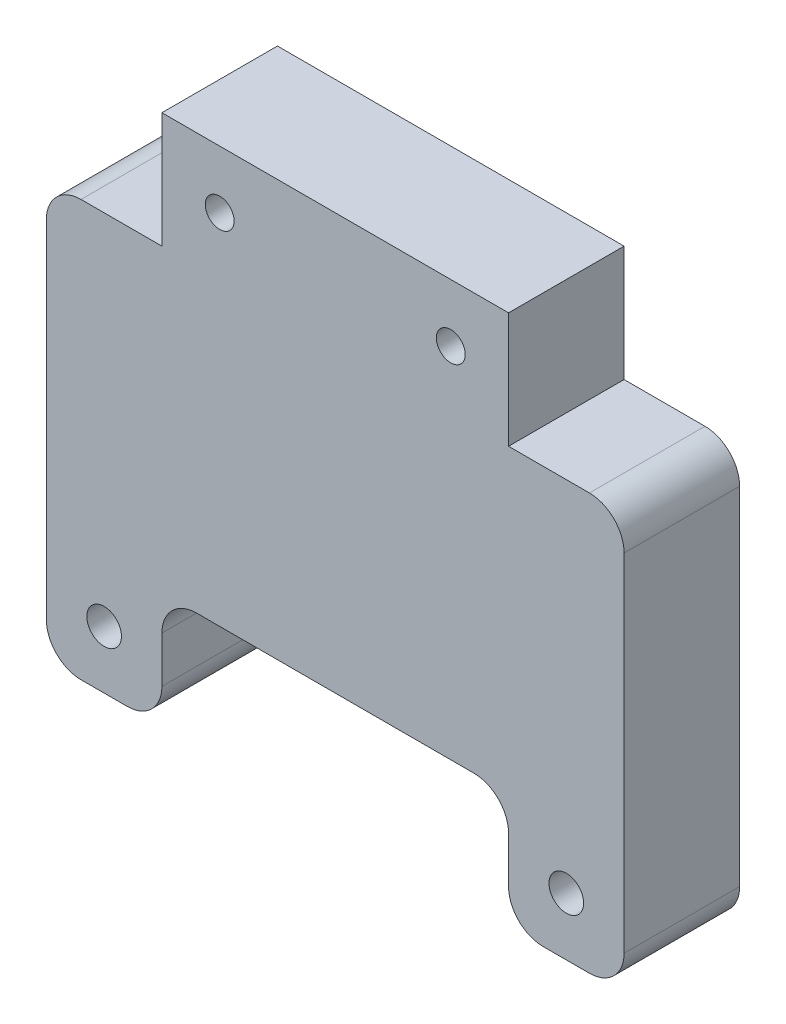
ISO-10303-21;
HEADER;
FILE_DESCRIPTION(('STEP AP214'),'2;1');
FILE_NAME('part.step','',(''),(''),'','','');
FILE_SCHEMA(('AUTOMOTIVE_DESIGN { 1 0 10303 214 1 1 1 1 }'));
ENDSEC;
DATA;
#1=APPLICATION_CONTEXT('core data for automotive mechanical design processes');
#2=APPLICATION_PROTOCOL_DEFINITION('international standard','automotive_design',2000,#1);
#3=PRODUCT_CONTEXT('',#1,'mechanical');
#4=PRODUCT('Part','Part','',(#3));
#5=PRODUCT_RELATED_PRODUCT_CATEGORY('part','',(#4));
#6=PRODUCT_DEFINITION_FORMATION('','',#4);
#7=PRODUCT_DEFINITION_CONTEXT('part definition',#1,'design');
#8=PRODUCT_DEFINITION('design','',#6,#7);
#9=PRODUCT_DEFINITION_SHAPE('','',#8);
#10=(LENGTH_UNIT() NAMED_UNIT(*) SI_UNIT(.MILLI.,.METRE.));
#11=(NAMED_UNIT(*) PLANE_ANGLE_UNIT() SI_UNIT($,.RADIAN.));
#12=(NAMED_UNIT(*) SI_UNIT($,.STERADIAN.) SOLID_ANGLE_UNIT());
#13=UNCERTAINTY_MEASURE_WITH_UNIT(LENGTH_MEASURE(1.E-05),#10,'distance_accuracy_value','');
#14=(GEOMETRIC_REPRESENTATION_CONTEXT(3) GLOBAL_UNCERTAINTY_ASSIGNED_CONTEXT((#13)) GLOBAL_UNIT_ASSIGNED_CONTEXT((#10,
#11,#12)) REPRESENTATION_CONTEXT('',''));
#15=CARTESIAN_POINT('',(0.,0.,0.));
#16=DIRECTION('',(0.,0.,1.));
#17=DIRECTION('',(1.,0.,0.));
#18=AXIS2_PLACEMENT_3D('',#15,#16,#17);
#19=CARTESIAN_POINT('',(0.,0.,10.));
#20=DIRECTION('',(0.,0.,1.));
#21=DIRECTION('',(1.,0.,0.));
#22=AXIS2_PLACEMENT_3D('',#19,#20,#21);
#23=PLANE('',#22);
#24=CARTESIAN_POINT('',(15.,41.,10.));
#25=DIRECTION('',(0.,0.,1.));
#26=DIRECTION('',(1.,0.,0.));
#27=AXIS2_PLACEMENT_3D('',#24,#25,#26);
#28=CIRCLE('',#27,1.25);
#29=CARTESIAN_POINT('',(16.25,41.,10.));
#30=VERTEX_POINT('',#29);
#31=EDGE_CURVE('E392',#30,#30,#28,.T.);
#32=ORIENTED_EDGE('',*,*,#31,.F.);
#33=EDGE_LOOP('',(#32));
#34=FACE_BOUND('',#33,.T.);
#35=CARTESIAN_POINT('',(5.,5.,10.));
#36=DIRECTION('',(0.,0.,1.));
#37=DIRECTION('',(1.,0.,0.));
#38=AXIS2_PLACEMENT_3D('',#35,#36,#37);
#39=CIRCLE('',#38,1.5);
#40=CARTESIAN_POINT('',(6.5,5.,10.));
#41=VERTEX_POINT('',#40);
#42=EDGE_CURVE('E192',#41,#41,#39,.T.);
#43=ORIENTED_EDGE('',*,*,#42,.F.);
#44=EDGE_LOOP('',(#43));
#45=FACE_BOUND('',#44,.T.);
#46=DIRECTION('',(0.,-1.,0.));
#47=VECTOR('',#46,1.);
#48=CARTESIAN_POINT('',(40.,10.,10.));
#49=LINE('',#48,#47);
#50=CARTESIAN_POINT('',(40.,7.,10.));
#51=VERTEX_POINT('',#50);
#52=CARTESIAN_POINT('',(40.,3.,10.));
#53=VERTEX_POINT('',#52);
#54=EDGE_CURVE('E306',#51,#53,#49,.T.);
#55=ORIENTED_EDGE('',*,*,#54,.T.);
#56=CARTESIAN_POINT('',(43.,3.,10.));
#57=DIRECTION('',(0.,0.,1.));
#58=DIRECTION('',(1.,0.,0.));
#59=AXIS2_PLACEMENT_3D('',#56,#57,#58);
#60=CIRCLE('',#59,3.);
#61=CARTESIAN_POINT('',(43.,0.,10.));
#62=VERTEX_POINT('',#61);
#63=EDGE_CURVE('E266',#53,#62,#60,.T.);
#64=ORIENTED_EDGE('',*,*,#63,.T.);
#65=DIRECTION('',(1.,0.,0.));
#66=VECTOR('',#65,1.);
#67=CARTESIAN_POINT('',(40.,0.,10.));
#68=LINE('',#67,#66);
#69=CARTESIAN_POINT('',(47.,0.,10.));
#70=VERTEX_POINT('',#69);
#71=EDGE_CURVE('E312',#62,#70,#68,.T.);
#72=ORIENTED_EDGE('',*,*,#71,.T.);
#73=CARTESIAN_POINT('',(47.,3.,10.));
#74=DIRECTION('',(0.,0.,1.));
#75=DIRECTION('',(1.,0.,0.));
#76=AXIS2_PLACEMENT_3D('',#73,#74,#75);
#77=CIRCLE('',#76,3.);
#78=CARTESIAN_POINT('',(50.,3.,10.));
#79=VERTEX_POINT('',#78);
#80=EDGE_CURVE('E264',#70,#79,#77,.T.);
#81=ORIENTED_EDGE('',*,*,#80,.T.);
#82=DIRECTION('',(0.,1.,0.));
#83=VECTOR('',#82,1.);
#84=CARTESIAN_POINT('',(50.,0.,10.));
#85=LINE('',#84,#83);
#86=CARTESIAN_POINT('',(50.,33.,10.));
#87=VERTEX_POINT('',#86);
#88=EDGE_CURVE('E163',#79,#87,#85,.T.);
#89=ORIENTED_EDGE('',*,*,#88,.T.);
#90=CARTESIAN_POINT('',(47.,33.,10.));
#91=DIRECTION('',(0.,0.,1.));
#92=DIRECTION('',(1.,0.,0.));
#93=AXIS2_PLACEMENT_3D('',#90,#91,#92);
#94=CIRCLE('',#93,3.);
#95=CARTESIAN_POINT('',(47.,36.,10.));
#96=VERTEX_POINT('',#95);
#97=EDGE_CURVE('E40',#87,#96,#94,.T.);
#98=ORIENTED_EDGE('',*,*,#97,.T.);
#99=DIRECTION('',(-1.,0.,0.));
#100=VECTOR('',#99,1.);
#101=CARTESIAN_POINT('',(50.,36.,10.));
#102=LINE('',#101,#100);
#103=CARTESIAN_POINT('',(40.,36.,10.));
#104=VERTEX_POINT('',#103);
#105=EDGE_CURVE('E153',#96,#104,#102,.T.);
#106=ORIENTED_EDGE('',*,*,#105,.T.);
#107=DIRECTION('',(0.,1.,0.));
#108=VECTOR('',#107,1.);
#109=CARTESIAN_POINT('',(40.,36.,10.));
#110=LINE('',#109,#108);
#111=CARTESIAN_POINT('',(40.,46.,10.));
#112=VERTEX_POINT('',#111);
#113=EDGE_CURVE('E158',#104,#112,#110,.T.);
#114=ORIENTED_EDGE('',*,*,#113,.T.);
#115=DIRECTION('',(-1.,0.,0.));
#116=VECTOR('',#115,1.);
#117=CARTESIAN_POINT('',(40.,46.,10.));
#118=LINE('',#117,#116);
#119=CARTESIAN_POINT('',(10.,46.,10.));
#120=VERTEX_POINT('',#119);
#121=EDGE_CURVE('E178',#112,#120,#118,.T.);
#122=ORIENTED_EDGE('',*,*,#121,.T.);
#123=DIRECTION('',(0.,-1.,0.));
#124=VECTOR('',#123,1.);
#125=CARTESIAN_POINT('',(10.,46.,10.));
#126=LINE('',#125,#124);
#127=CARTESIAN_POINT('',(10.,36.,10.));
#128=VERTEX_POINT('',#127);
#129=EDGE_CURVE('E180',#120,#128,#126,.T.);
#130=ORIENTED_EDGE('',*,*,#129,.T.);
#131=DIRECTION('',(-1.,0.,0.));
#132=VECTOR('',#131,1.);
#133=CARTESIAN_POINT('',(10.,36.,10.));
#134=LINE('',#133,#132);
#135=CARTESIAN_POINT('',(3.,36.,10.));
#136=VERTEX_POINT('',#135);
#137=EDGE_CURVE('E185',#128,#136,#134,.T.);
#138=ORIENTED_EDGE('',*,*,#137,.T.);
#139=CARTESIAN_POINT('',(3.,33.,10.));
#140=DIRECTION('',(0.,0.,1.));
#141=DIRECTION('',(1.,0.,0.));
#142=AXIS2_PLACEMENT_3D('',#139,#140,#141);
#143=CIRCLE('',#142,3.);
#144=CARTESIAN_POINT('',(0.,33.,10.));
#145=VERTEX_POINT('',#144);
#146=EDGE_CURVE('E258',#136,#145,#143,.T.);
#147=ORIENTED_EDGE('',*,*,#146,.T.);
#148=DIRECTION('',(0.,-1.,0.));
#149=VECTOR('',#148,1.);
#150=CARTESIAN_POINT('',(0.,0.,10.));
#151=LINE('',#150,#149);
#152=CARTESIAN_POINT('',(0.,3.,10.));
#153=VERTEX_POINT('',#152);
#154=EDGE_CURVE('E219',#145,#153,#151,.T.);
#155=ORIENTED_EDGE('',*,*,#154,.T.);
#156=CARTESIAN_POINT('',(3.,3.,10.));
#157=DIRECTION('',(0.,0.,1.));
#158=DIRECTION('',(1.,0.,0.));
#159=AXIS2_PLACEMENT_3D('',#156,#157,#158);
#160=CIRCLE('',#159,3.);
#161=CARTESIAN_POINT('',(3.,0.,10.));
#162=VERTEX_POINT('',#161);
#163=EDGE_CURVE('E260',#153,#162,#160,.T.);
#164=ORIENTED_EDGE('',*,*,#163,.T.);
#165=DIRECTION('',(1.,0.,0.));
#166=VECTOR('',#165,1.);
#167=CARTESIAN_POINT('',(0.,0.,10.));
#168=LINE('',#167,#166);
#169=CARTESIAN_POINT('',(7.,0.,10.));
#170=VERTEX_POINT('',#169);
#171=EDGE_CURVE('E410',#162,#170,#168,.T.);
#172=ORIENTED_EDGE('',*,*,#171,.T.);
#173=CARTESIAN_POINT('',(7.,3.,10.));
#174=DIRECTION('',(0.,0.,1.));
#175=DIRECTION('',(1.,0.,0.));
#176=AXIS2_PLACEMENT_3D('',#173,#174,#175);
#177=CIRCLE('',#176,3.);
#178=CARTESIAN_POINT('',(10.,3.,10.));
#179=VERTEX_POINT('',#178);
#180=EDGE_CURVE('E262',#170,#179,#177,.T.);
#181=ORIENTED_EDGE('',*,*,#180,.T.);
#182=DIRECTION('',(0.,1.,0.));
#183=VECTOR('',#182,1.);
#184=CARTESIAN_POINT('',(10.,0.,10.));
#185=LINE('',#184,#183);
#186=CARTESIAN_POINT('',(10.,7.,10.));
#187=VERTEX_POINT('',#186);
#188=EDGE_CURVE('E316',#179,#187,#185,.T.);
#189=ORIENTED_EDGE('',*,*,#188,.T.);
#190=CARTESIAN_POINT('',(13.,7.,10.));
#191=DIRECTION('',(0.,0.,1.));
#192=DIRECTION('',(1.,0.,0.));
#193=AXIS2_PLACEMENT_3D('',#190,#191,#192);
#194=CIRCLE('',#193,3.);
#195=CARTESIAN_POINT('',(13.,10.,10.));
#196=VERTEX_POINT('',#195);
#197=EDGE_CURVE('E288',#187,#196,#194,.F.);
#198=ORIENTED_EDGE('',*,*,#197,.T.);
#199=DIRECTION('',(1.,0.,0.));
#200=VECTOR('',#199,1.);
#201=CARTESIAN_POINT('',(10.,10.,10.));
#202=LINE('',#201,#200);
#203=CARTESIAN_POINT('',(37.,10.,10.));
#204=VERTEX_POINT('',#203);
#205=EDGE_CURVE('E308',#196,#204,#202,.T.);
#206=ORIENTED_EDGE('',*,*,#205,.T.);
#207=CARTESIAN_POINT('',(37.,7.,10.));
#208=DIRECTION('',(0.,0.,1.));
#209=DIRECTION('',(1.,0.,0.));
#210=AXIS2_PLACEMENT_3D('',#207,#208,#209);
#211=CIRCLE('',#210,3.);
#212=EDGE_CURVE('E11',#204,#51,#211,.F.);
#213=ORIENTED_EDGE('',*,*,#212,.T.);
#214=EDGE_LOOP('',(#55,#64,#72,#81,#89,#98,#106,#114,#122,#130,#138,#147,#155,#164,#172,#181,
#189,#198,#206,#213));
#215=FACE_BOUND('',#214,.T.);
#216=CARTESIAN_POINT('',(45.,5.,10.));
#217=DIRECTION('',(0.,0.,1.));
#218=DIRECTION('',(1.,0.,0.));
#219=AXIS2_PLACEMENT_3D('',#216,#217,#218);
#220=CIRCLE('',#219,1.5);
#221=CARTESIAN_POINT('',(46.5,5.,10.));
#222=VERTEX_POINT('',#221);
#223=EDGE_CURVE('E398',#222,#222,#220,.T.);
#224=ORIENTED_EDGE('',*,*,#223,.F.);
#225=EDGE_LOOP('',(#224));
#226=FACE_BOUND('',#225,.T.);
#227=CARTESIAN_POINT('',(35.,41.,10.));
#228=DIRECTION('',(0.,0.,1.));
#229=DIRECTION('',(1.,0.,0.));
#230=AXIS2_PLACEMENT_3D('',#227,#228,#229);
#231=CIRCLE('',#230,1.25);
#232=CARTESIAN_POINT('',(36.25,41.,10.));
#233=VERTEX_POINT('',#232);
#234=EDGE_CURVE('E383',#233,#233,#231,.T.);
#235=ORIENTED_EDGE('',*,*,#234,.F.);
#236=EDGE_LOOP('',(#235));
#237=FACE_BOUND('',#236,.T.);
#238=ADVANCED_FACE('F17',(#34,#45,#215,#226,#237),#23,.T.);
#239=CARTESIAN_POINT('',(0.,0.,0.));
#240=DIRECTION('',(0.,0.,1.));
#241=DIRECTION('',(1.,0.,0.));
#242=AXIS2_PLACEMENT_3D('',#239,#240,#241);
#243=PLANE('',#242);
#244=DIRECTION('',(1.,0.,0.));
#245=VECTOR('',#244,1.);
#246=CARTESIAN_POINT('',(40.,0.,0.));
#247=LINE('',#246,#245);
#248=CARTESIAN_POINT('',(43.,0.,0.));
#249=VERTEX_POINT('',#248);
#250=CARTESIAN_POINT('',(47.,0.,0.));
#251=VERTEX_POINT('',#250);
#252=EDGE_CURVE('E204',#249,#251,#247,.T.);
#253=ORIENTED_EDGE('',*,*,#252,.F.);
#254=CARTESIAN_POINT('',(43.,3.,0.));
#255=DIRECTION('',(0.,0.,1.));
#256=DIRECTION('',(1.,0.,0.));
#257=AXIS2_PLACEMENT_3D('',#254,#255,#256);
#258=CIRCLE('',#257,3.);
#259=CARTESIAN_POINT('',(40.,3.,0.));
#260=VERTEX_POINT('',#259);
#261=EDGE_CURVE('E255',#249,#260,#258,.F.);
#262=ORIENTED_EDGE('',*,*,#261,.T.);
#263=DIRECTION('',(0.,-1.,0.));
#264=VECTOR('',#263,1.);
#265=CARTESIAN_POINT('',(40.,10.,0.));
#266=LINE('',#265,#264);
#267=CARTESIAN_POINT('',(40.,7.,0.));
#268=VERTEX_POINT('',#267);
#269=EDGE_CURVE('E201',#268,#260,#266,.T.);
#270=ORIENTED_EDGE('',*,*,#269,.F.);
#271=CARTESIAN_POINT('',(37.,7.,0.));
#272=DIRECTION('',(0.,0.,1.));
#273=DIRECTION('',(1.,0.,0.));
#274=AXIS2_PLACEMENT_3D('',#271,#272,#273);
#275=CIRCLE('',#274,3.);
#276=CARTESIAN_POINT('',(37.,10.,0.));
#277=VERTEX_POINT('',#276);
#278=EDGE_CURVE('E25',#268,#277,#275,.T.);
#279=ORIENTED_EDGE('',*,*,#278,.T.);
#280=DIRECTION('',(1.,0.,0.));
#281=VECTOR('',#280,1.);
#282=CARTESIAN_POINT('',(10.,10.,0.));
#283=LINE('',#282,#281);
#284=CARTESIAN_POINT('',(13.,10.,0.));
#285=VERTEX_POINT('',#284);
#286=EDGE_CURVE('E198',#285,#277,#283,.T.);
#287=ORIENTED_EDGE('',*,*,#286,.F.);
#288=CARTESIAN_POINT('',(13.,7.,0.));
#289=DIRECTION('',(0.,0.,1.));
#290=DIRECTION('',(1.,0.,0.));
#291=AXIS2_PLACEMENT_3D('',#288,#289,#290);
#292=CIRCLE('',#291,3.);
#293=CARTESIAN_POINT('',(10.,7.,0.));
#294=VERTEX_POINT('',#293);
#295=EDGE_CURVE('E286',#285,#294,#292,.T.);
#296=ORIENTED_EDGE('',*,*,#295,.T.);
#297=DIRECTION('',(0.,1.,0.));
#298=VECTOR('',#297,1.);
#299=CARTESIAN_POINT('',(10.,0.,0.));
#300=LINE('',#299,#298);
#301=CARTESIAN_POINT('',(10.,3.,0.));
#302=VERTEX_POINT('',#301);
#303=EDGE_CURVE('E195',#302,#294,#300,.T.);
#304=ORIENTED_EDGE('',*,*,#303,.F.);
#305=CARTESIAN_POINT('',(7.,3.,0.));
#306=DIRECTION('',(0.,0.,1.));
#307=DIRECTION('',(1.,0.,0.));
#308=AXIS2_PLACEMENT_3D('',#305,#306,#307);
#309=CIRCLE('',#308,3.);
#310=CARTESIAN_POINT('',(7.,0.,0.));
#311=VERTEX_POINT('',#310);
#312=EDGE_CURVE('E251',#302,#311,#309,.F.);
#313=ORIENTED_EDGE('',*,*,#312,.T.);
#314=DIRECTION('',(1.,0.,0.));
#315=VECTOR('',#314,1.);
#316=CARTESIAN_POINT('',(0.,0.,0.));
#317=LINE('',#316,#315);
#318=CARTESIAN_POINT('',(3.,0.,0.));
#319=VERTEX_POINT('',#318);
#320=EDGE_CURVE('E191',#319,#311,#317,.T.);
#321=ORIENTED_EDGE('',*,*,#320,.F.);
#322=CARTESIAN_POINT('',(3.,3.,0.));
#323=DIRECTION('',(0.,0.,1.));
#324=DIRECTION('',(1.,0.,0.));
#325=AXIS2_PLACEMENT_3D('',#322,#323,#324);
#326=CIRCLE('',#325,3.);
#327=CARTESIAN_POINT('',(0.,3.,0.));
#328=VERTEX_POINT('',#327);
#329=EDGE_CURVE('E249',#319,#328,#326,.F.);
#330=ORIENTED_EDGE('',*,*,#329,.T.);
#331=DIRECTION('',(0.,-1.,0.));
#332=VECTOR('',#331,1.);
#333=CARTESIAN_POINT('',(0.,0.,0.));
#334=LINE('',#333,#332);
#335=CARTESIAN_POINT('',(0.,33.,0.));
#336=VERTEX_POINT('',#335);
#337=EDGE_CURVE('E188',#336,#328,#334,.T.);
#338=ORIENTED_EDGE('',*,*,#337,.F.);
#339=CARTESIAN_POINT('',(3.,33.,0.));
#340=DIRECTION('',(0.,0.,1.));
#341=DIRECTION('',(1.,0.,0.));
#342=AXIS2_PLACEMENT_3D('',#339,#340,#341);
#343=CIRCLE('',#342,3.);
#344=CARTESIAN_POINT('',(3.,36.,0.));
#345=VERTEX_POINT('',#344);
#346=EDGE_CURVE('E247',#336,#345,#343,.F.);
#347=ORIENTED_EDGE('',*,*,#346,.T.);
#348=DIRECTION('',(-1.,0.,0.));
#349=VECTOR('',#348,1.);
#350=CARTESIAN_POINT('',(10.,36.,0.));
#351=LINE('',#350,#349);
#352=CARTESIAN_POINT('',(10.,36.,0.));
#353=VERTEX_POINT('',#352);
#354=EDGE_CURVE('E217',#353,#345,#351,.T.);
#355=ORIENTED_EDGE('',*,*,#354,.F.);
#356=DIRECTION('',(0.,-1.,0.));
#357=VECTOR('',#356,1.);
#358=CARTESIAN_POINT('',(10.,46.,0.));
#359=LINE('',#358,#357);
#360=CARTESIAN_POINT('',(10.,46.,0.));
#361=VERTEX_POINT('',#360);
#362=EDGE_CURVE('E215',#361,#353,#359,.T.);
#363=ORIENTED_EDGE('',*,*,#362,.F.);
#364=DIRECTION('',(-1.,0.,0.));
#365=VECTOR('',#364,1.);
#366=CARTESIAN_POINT('',(40.,46.,0.));
#367=LINE('',#366,#365);
#368=CARTESIAN_POINT('',(40.,46.,0.));
#369=VERTEX_POINT('',#368);
#370=EDGE_CURVE('E213',#369,#361,#367,.T.);
#371=ORIENTED_EDGE('',*,*,#370,.F.);
#372=DIRECTION('',(0.,1.,0.));
#373=VECTOR('',#372,1.);
#374=CARTESIAN_POINT('',(40.,36.,0.));
#375=LINE('',#374,#373);
#376=CARTESIAN_POINT('',(40.,36.,0.));
#377=VERTEX_POINT('',#376);
#378=EDGE_CURVE('E211',#377,#369,#375,.T.);
#379=ORIENTED_EDGE('',*,*,#378,.F.);
#380=DIRECTION('',(-1.,0.,0.));
#381=VECTOR('',#380,1.);
#382=CARTESIAN_POINT('',(50.,36.,0.));
#383=LINE('',#382,#381);
#384=CARTESIAN_POINT('',(47.,36.,0.));
#385=VERTEX_POINT('',#384);
#386=EDGE_CURVE('E169',#385,#377,#383,.T.);
#387=ORIENTED_EDGE('',*,*,#386,.F.);
#388=CARTESIAN_POINT('',(47.,33.,0.));
#389=DIRECTION('',(0.,0.,1.));
#390=DIRECTION('',(1.,0.,0.));
#391=AXIS2_PLACEMENT_3D('',#388,#389,#390);
#392=CIRCLE('',#391,3.);
#393=CARTESIAN_POINT('',(50.,33.,0.));
#394=VERTEX_POINT('',#393);
#395=EDGE_CURVE('E245',#385,#394,#392,.F.);
#396=ORIENTED_EDGE('',*,*,#395,.T.);
#397=DIRECTION('',(0.,1.,0.));
#398=VECTOR('',#397,1.);
#399=CARTESIAN_POINT('',(50.,0.,0.));
#400=LINE('',#399,#398);
#401=CARTESIAN_POINT('',(50.,3.,0.));
#402=VERTEX_POINT('',#401);
#403=EDGE_CURVE('E207',#402,#394,#400,.T.);
#404=ORIENTED_EDGE('',*,*,#403,.F.);
#405=CARTESIAN_POINT('',(47.,3.,0.));
#406=DIRECTION('',(0.,0.,1.));
#407=DIRECTION('',(1.,0.,0.));
#408=AXIS2_PLACEMENT_3D('',#405,#406,#407);
#409=CIRCLE('',#408,3.);
#410=EDGE_CURVE('E253',#402,#251,#409,.F.);
#411=ORIENTED_EDGE('',*,*,#410,.T.);
#412=EDGE_LOOP('',(#253,#262,#270,#279,#287,#296,#304,#313,#321,#330,#338,#347,#355,#363,#371,
#379,#387,#396,#404,#411));
#413=FACE_BOUND('',#412,.T.);
#414=CARTESIAN_POINT('',(5.,5.,0.));
#415=DIRECTION('',(0.,0.,1.));
#416=DIRECTION('',(1.,0.,0.));
#417=AXIS2_PLACEMENT_3D('',#414,#415,#416);
#418=CIRCLE('',#417,1.5);
#419=CARTESIAN_POINT('',(6.5,5.,0.));
#420=VERTEX_POINT('',#419);
#421=EDGE_CURVE('E401',#420,#420,#418,.T.);
#422=ORIENTED_EDGE('',*,*,#421,.T.);
#423=EDGE_LOOP('',(#422));
#424=FACE_BOUND('',#423,.T.);
#425=CARTESIAN_POINT('',(45.,5.,0.));
#426=DIRECTION('',(0.,0.,1.));
#427=DIRECTION('',(1.,0.,0.));
#428=AXIS2_PLACEMENT_3D('',#425,#426,#427);
#429=CIRCLE('',#428,1.5);
#430=CARTESIAN_POINT('',(46.5,5.,0.));
#431=VERTEX_POINT('',#430);
#432=EDGE_CURVE('E395',#431,#431,#429,.T.);
#433=ORIENTED_EDGE('',*,*,#432,.T.);
#434=EDGE_LOOP('',(#433));
#435=FACE_BOUND('',#434,.T.);
#436=CARTESIAN_POINT('',(15.,41.,0.));
#437=DIRECTION('',(0.,0.,1.));
#438=DIRECTION('',(1.,0.,0.));
#439=AXIS2_PLACEMENT_3D('',#436,#437,#438);
#440=CIRCLE('',#439,1.25);
#441=CARTESIAN_POINT('',(16.25,41.,0.));
#442=VERTEX_POINT('',#441);
#443=EDGE_CURVE('E389',#442,#442,#440,.T.);
#444=ORIENTED_EDGE('',*,*,#443,.T.);
#445=EDGE_LOOP('',(#444));
#446=FACE_BOUND('',#445,.T.);
#447=CARTESIAN_POINT('',(35.,41.,0.));
#448=DIRECTION('',(0.,0.,1.));
#449=DIRECTION('',(1.,0.,0.));
#450=AXIS2_PLACEMENT_3D('',#447,#448,#449);
#451=CIRCLE('',#450,1.25);
#452=CARTESIAN_POINT('',(36.25,41.,0.));
#453=VERTEX_POINT('',#452);
#454=EDGE_CURVE('E386',#453,#453,#451,.T.);
#455=ORIENTED_EDGE('',*,*,#454,.T.);
#456=EDGE_LOOP('',(#455));
#457=FACE_BOUND('',#456,.T.);
#458=ADVANCED_FACE('F293',(#413,#424,#435,#446,#457),#243,.F.);
#459=CARTESIAN_POINT('',(0.,0.,10.));
#460=DIRECTION('',(1.,0.,0.));
#461=DIRECTION('',(0.,0.,-1.));
#462=AXIS2_PLACEMENT_3D('',#459,#460,#461);
#463=PLANE('',#462);
#464=ORIENTED_EDGE('',*,*,#337,.T.);
#465=DIRECTION('',(0.,0.,-1.));
#466=VECTOR('',#465,1.);
#467=CARTESIAN_POINT('',(0.,3.,10.));
#468=LINE('',#467,#466);
#469=EDGE_CURVE('E281',#328,#153,#468,.F.);
#470=ORIENTED_EDGE('',*,*,#469,.T.);
#471=ORIENTED_EDGE('',*,*,#154,.F.);
#472=DIRECTION('',(0.,0.,-1.));
#473=VECTOR('',#472,1.);
#474=CARTESIAN_POINT('',(0.,33.,10.));
#475=LINE('',#474,#473);
#476=EDGE_CURVE('E278',#145,#336,#475,.T.);
#477=ORIENTED_EDGE('',*,*,#476,.T.);
#478=EDGE_LOOP('',(#464,#470,#471,#477));
#479=FACE_BOUND('',#478,.T.);
#480=ADVANCED_FACE('F359',(#479),#463,.F.);
#481=CARTESIAN_POINT('',(0.,0.,10.));
#482=DIRECTION('',(0.,1.,0.));
#483=DIRECTION('',(0.,0.,1.));
#484=AXIS2_PLACEMENT_3D('',#481,#482,#483);
#485=PLANE('',#484);
#486=ORIENTED_EDGE('',*,*,#320,.T.);
#487=DIRECTION('',(0.,0.,-1.));
#488=VECTOR('',#487,1.);
#489=CARTESIAN_POINT('',(7.,0.,10.));
#490=LINE('',#489,#488);
#491=EDGE_CURVE('E276',#311,#170,#490,.F.);
#492=ORIENTED_EDGE('',*,*,#491,.T.);
#493=ORIENTED_EDGE('',*,*,#171,.F.);
#494=DIRECTION('',(0.,0.,-1.));
#495=VECTOR('',#494,1.);
#496=CARTESIAN_POINT('',(3.,0.,10.));
#497=LINE('',#496,#495);
#498=EDGE_CURVE('E273',#162,#319,#497,.T.);
#499=ORIENTED_EDGE('',*,*,#498,.T.);
#500=EDGE_LOOP('',(#486,#492,#493,#499));
#501=FACE_BOUND('',#500,.T.);
#502=ADVANCED_FACE('F426',(#501),#485,.F.);
#503=CARTESIAN_POINT('',(10.,0.,10.));
#504=DIRECTION('',(-1.,0.,0.));
#505=DIRECTION('',(0.,0.,1.));
#506=AXIS2_PLACEMENT_3D('',#503,#504,#505);
#507=PLANE('',#506);
#508=ORIENTED_EDGE('',*,*,#303,.T.);
#509=DIRECTION('',(0.,0.,-1.));
#510=VECTOR('',#509,1.);
#511=CARTESIAN_POINT('',(10.,7.,10.));
#512=LINE('',#511,#510);
#513=EDGE_CURVE('E233',#294,#187,#512,.F.);
#514=ORIENTED_EDGE('',*,*,#513,.T.);
#515=ORIENTED_EDGE('',*,*,#188,.F.);
#516=DIRECTION('',(0.,0.,-1.));
#517=VECTOR('',#516,1.);
#518=CARTESIAN_POINT('',(10.,3.,10.));
#519=LINE('',#518,#517);
#520=EDGE_CURVE('E230',#179,#302,#519,.T.);
#521=ORIENTED_EDGE('',*,*,#520,.T.);
#522=EDGE_LOOP('',(#508,#514,#515,#521));
#523=FACE_BOUND('',#522,.T.);
#524=ADVANCED_FACE('F420',(#523),#507,.F.);
#525=CARTESIAN_POINT('',(10.,10.,10.));
#526=DIRECTION('',(0.,1.,0.));
#527=DIRECTION('',(0.,0.,1.));
#528=AXIS2_PLACEMENT_3D('',#525,#526,#527);
#529=PLANE('',#528);
#530=ORIENTED_EDGE('',*,*,#205,.F.);
#531=DIRECTION('',(0.,0.,-1.));
#532=VECTOR('',#531,1.);
#533=CARTESIAN_POINT('',(13.,10.,0.));
#534=LINE('',#533,#532);
#535=EDGE_CURVE('E227',#196,#285,#534,.T.);
#536=ORIENTED_EDGE('',*,*,#535,.T.);
#537=ORIENTED_EDGE('',*,*,#286,.T.);
#538=DIRECTION('',(0.,0.,-1.));
#539=VECTOR('',#538,1.);
#540=CARTESIAN_POINT('',(37.,10.,10.));
#541=LINE('',#540,#539);
#542=EDGE_CURVE('E172',#277,#204,#541,.F.);
#543=ORIENTED_EDGE('',*,*,#542,.T.);
#544=EDGE_LOOP('',(#530,#536,#537,#543));
#545=FACE_BOUND('',#544,.T.);
#546=ADVANCED_FACE('F300',(#545),#529,.F.);
#547=CARTESIAN_POINT('',(40.,10.,10.));
#548=DIRECTION('',(1.,0.,0.));
#549=DIRECTION('',(0.,0.,-1.));
#550=AXIS2_PLACEMENT_3D('',#547,#548,#549);
#551=PLANE('',#550);
#552=ORIENTED_EDGE('',*,*,#54,.F.);
#553=DIRECTION('',(0.,0.,-1.));
#554=VECTOR('',#553,1.);
#555=CARTESIAN_POINT('',(40.,7.,0.));
#556=LINE('',#555,#554);
#557=EDGE_CURVE('E237',#51,#268,#556,.T.);
#558=ORIENTED_EDGE('',*,*,#557,.T.);
#559=ORIENTED_EDGE('',*,*,#269,.T.);
#560=DIRECTION('',(0.,0.,-1.));
#561=VECTOR('',#560,1.);
#562=CARTESIAN_POINT('',(40.,3.,10.));
#563=LINE('',#562,#561);
#564=EDGE_CURVE('E235',#260,#53,#563,.F.);
#565=ORIENTED_EDGE('',*,*,#564,.T.);
#566=EDGE_LOOP('',(#552,#558,#559,#565));
#567=FACE_BOUND('',#566,.T.);
#568=ADVANCED_FACE('F310',(#567),#551,.F.);
#569=CARTESIAN_POINT('',(40.,0.,10.));
#570=DIRECTION('',(0.,1.,0.));
#571=DIRECTION('',(0.,0.,1.));
#572=AXIS2_PLACEMENT_3D('',#569,#570,#571);
#573=PLANE('',#572);
#574=ORIENTED_EDGE('',*,*,#71,.F.);
#575=DIRECTION('',(0.,0.,-1.));
#576=VECTOR('',#575,1.);
#577=CARTESIAN_POINT('',(43.,0.,10.));
#578=LINE('',#577,#576);
#579=EDGE_CURVE('E242',#62,#249,#578,.T.);
#580=ORIENTED_EDGE('',*,*,#579,.T.);
#581=ORIENTED_EDGE('',*,*,#252,.T.);
#582=DIRECTION('',(0.,0.,-1.));
#583=VECTOR('',#582,1.);
#584=CARTESIAN_POINT('',(47.,0.,10.));
#585=LINE('',#584,#583);
#586=EDGE_CURVE('E240',#251,#70,#585,.F.);
#587=ORIENTED_EDGE('',*,*,#586,.T.);
#588=EDGE_LOOP('',(#574,#580,#581,#587));
#589=FACE_BOUND('',#588,.T.);
#590=ADVANCED_FACE('F469',(#589),#573,.F.);
#591=CARTESIAN_POINT('',(50.,0.,10.));
#592=DIRECTION('',(-1.,0.,0.));
#593=DIRECTION('',(0.,0.,1.));
#594=AXIS2_PLACEMENT_3D('',#591,#592,#593);
#595=PLANE('',#594);
#596=ORIENTED_EDGE('',*,*,#88,.F.);
#597=DIRECTION('',(0.,0.,-1.));
#598=VECTOR('',#597,1.);
#599=CARTESIAN_POINT('',(50.,3.,10.));
#600=LINE('',#599,#598);
#601=EDGE_CURVE('E270',#79,#402,#600,.T.);
#602=ORIENTED_EDGE('',*,*,#601,.T.);
#603=ORIENTED_EDGE('',*,*,#403,.T.);
#604=DIRECTION('',(0.,0.,-1.));
#605=VECTOR('',#604,1.);
#606=CARTESIAN_POINT('',(50.,33.,10.));
#607=LINE('',#606,#605);
#608=EDGE_CURVE('E268',#394,#87,#607,.F.);
#609=ORIENTED_EDGE('',*,*,#608,.T.);
#610=EDGE_LOOP('',(#596,#602,#603,#609));
#611=FACE_BOUND('',#610,.T.);
#612=ADVANCED_FACE('F472',(#611),#595,.F.);
#613=CARTESIAN_POINT('',(50.,36.,10.));
#614=DIRECTION('',(0.,-1.,0.));
#615=DIRECTION('',(1.,0.,0.));
#616=AXIS2_PLACEMENT_3D('',#613,#614,#615);
#617=PLANE('',#616);
#618=ORIENTED_EDGE('',*,*,#105,.F.);
#619=DIRECTION('',(0.,0.,-1.));
#620=VECTOR('',#619,1.);
#621=CARTESIAN_POINT('',(47.,36.,10.));
#622=LINE('',#621,#620);
#623=EDGE_CURVE('E284',#96,#385,#622,.T.);
#624=ORIENTED_EDGE('',*,*,#623,.T.);
#625=ORIENTED_EDGE('',*,*,#386,.T.);
#626=DIRECTION('',(0.,0.,-1.));
#627=VECTOR('',#626,1.);
#628=CARTESIAN_POINT('',(40.,36.,10.));
#629=LINE('',#628,#627);
#630=EDGE_CURVE('E166',#104,#377,#629,.T.);
#631=ORIENTED_EDGE('',*,*,#630,.F.);
#632=EDGE_LOOP('',(#618,#624,#625,#631));
#633=FACE_BOUND('',#632,.T.);
#634=ADVANCED_FACE('F167',(#633),#617,.F.);
#635=CARTESIAN_POINT('',(40.,36.,10.));
#636=DIRECTION('',(-1.,0.,0.));
#637=DIRECTION('',(0.,0.,1.));
#638=AXIS2_PLACEMENT_3D('',#635,#636,#637);
#639=PLANE('',#638);
#640=ORIENTED_EDGE('',*,*,#378,.T.);
#641=DIRECTION('',(0.,0.,-1.));
#642=VECTOR('',#641,1.);
#643=CARTESIAN_POINT('',(40.,46.,10.));
#644=LINE('',#643,#642);
#645=EDGE_CURVE('E173',#112,#369,#644,.T.);
#646=ORIENTED_EDGE('',*,*,#645,.F.);
#647=ORIENTED_EDGE('',*,*,#113,.F.);
#648=ORIENTED_EDGE('',*,*,#630,.T.);
#649=EDGE_LOOP('',(#640,#646,#647,#648));
#650=FACE_BOUND('',#649,.T.);
#651=ADVANCED_FACE('F175',(#650),#639,.F.);
#652=CARTESIAN_POINT('',(40.,46.,10.));
#653=DIRECTION('',(0.,-1.,0.));
#654=DIRECTION('',(1.,0.,0.));
#655=AXIS2_PLACEMENT_3D('',#652,#653,#654);
#656=PLANE('',#655);
#657=ORIENTED_EDGE('',*,*,#370,.T.);
#658=DIRECTION('',(0.,0.,-1.));
#659=VECTOR('',#658,1.);
#660=CARTESIAN_POINT('',(10.,46.,10.));
#661=LINE('',#660,#659);
#662=EDGE_CURVE('E222',#120,#361,#661,.T.);
#663=ORIENTED_EDGE('',*,*,#662,.F.);
#664=ORIENTED_EDGE('',*,*,#121,.F.);
#665=ORIENTED_EDGE('',*,*,#645,.T.);
#666=EDGE_LOOP('',(#657,#663,#664,#665));
#667=FACE_BOUND('',#666,.T.);
#668=ADVANCED_FACE('F329',(#667),#656,.F.);
#669=CARTESIAN_POINT('',(10.,46.,10.));
#670=DIRECTION('',(1.,0.,0.));
#671=DIRECTION('',(0.,1.,0.));
#672=AXIS2_PLACEMENT_3D('',#669,#670,#671);
#673=PLANE('',#672);
#674=ORIENTED_EDGE('',*,*,#362,.T.);
#675=DIRECTION('',(0.,0.,-1.));
#676=VECTOR('',#675,1.);
#677=CARTESIAN_POINT('',(10.,36.,10.));
#678=LINE('',#677,#676);
#679=EDGE_CURVE('E187',#128,#353,#678,.T.);
#680=ORIENTED_EDGE('',*,*,#679,.F.);
#681=ORIENTED_EDGE('',*,*,#129,.F.);
#682=ORIENTED_EDGE('',*,*,#662,.T.);
#683=EDGE_LOOP('',(#674,#680,#681,#682));
#684=FACE_BOUND('',#683,.T.);
#685=ADVANCED_FACE('F335',(#684),#673,.F.);
#686=CARTESIAN_POINT('',(10.,36.,10.));
#687=DIRECTION('',(0.,-1.,0.));
#688=DIRECTION('',(0.,0.,-1.));
#689=AXIS2_PLACEMENT_3D('',#686,#687,#688);
#690=PLANE('',#689);
#691=ORIENTED_EDGE('',*,*,#354,.T.);
#692=DIRECTION('',(0.,0.,-1.));
#693=VECTOR('',#692,1.);
#694=CARTESIAN_POINT('',(3.,36.,10.));
#695=LINE('',#694,#693);
#696=EDGE_CURVE('E32',#345,#136,#695,.F.);
#697=ORIENTED_EDGE('',*,*,#696,.T.);
#698=ORIENTED_EDGE('',*,*,#137,.F.);
#699=ORIENTED_EDGE('',*,*,#679,.T.);
#700=EDGE_LOOP('',(#691,#697,#698,#699));
#701=FACE_BOUND('',#700,.T.);
#702=ADVANCED_FACE('F337',(#701),#690,.F.);
#703=CARTESIAN_POINT('',(5.,5.,10.));
#704=DIRECTION('',(0.,0.,-1.));
#705=DIRECTION('',(-1.,0.,0.));
#706=AXIS2_PLACEMENT_3D('',#703,#704,#705);
#707=CYLINDRICAL_SURFACE('',#706,1.5);
#708=ORIENTED_EDGE('',*,*,#42,.T.);
#709=EDGE_LOOP('',(#708));
#710=FACE_BOUND('',#709,.T.);
#711=ORIENTED_EDGE('',*,*,#421,.F.);
#712=EDGE_LOOP('',(#711));
#713=FACE_BOUND('',#712,.T.);
#714=ADVANCED_FACE('F339',(#710,#713),#707,.F.);
#715=CARTESIAN_POINT('',(45.,5.,10.));
#716=DIRECTION('',(0.,0.,-1.));
#717=DIRECTION('',(-1.,0.,0.));
#718=AXIS2_PLACEMENT_3D('',#715,#716,#717);
#719=CYLINDRICAL_SURFACE('',#718,1.5);
#720=ORIENTED_EDGE('',*,*,#223,.T.);
#721=EDGE_LOOP('',(#720));
#722=FACE_BOUND('',#721,.T.);
#723=ORIENTED_EDGE('',*,*,#432,.F.);
#724=EDGE_LOOP('',(#723));
#725=FACE_BOUND('',#724,.T.);
#726=ADVANCED_FACE('F347',(#722,#725),#719,.F.);
#727=CARTESIAN_POINT('',(15.,41.,10.));
#728=DIRECTION('',(0.,0.,-1.));
#729=DIRECTION('',(-1.,0.,0.));
#730=AXIS2_PLACEMENT_3D('',#727,#728,#729);
#731=CYLINDRICAL_SURFACE('',#730,1.25);
#732=ORIENTED_EDGE('',*,*,#31,.T.);
#733=EDGE_LOOP('',(#732));
#734=FACE_BOUND('',#733,.T.);
#735=ORIENTED_EDGE('',*,*,#443,.F.);
#736=EDGE_LOOP('',(#735));
#737=FACE_BOUND('',#736,.T.);
#738=ADVANCED_FACE('F365',(#734,#737),#731,.F.);
#739=CARTESIAN_POINT('',(35.,41.,10.));
#740=DIRECTION('',(0.,0.,-1.));
#741=DIRECTION('',(-1.,0.,0.));
#742=AXIS2_PLACEMENT_3D('',#739,#740,#741);
#743=CYLINDRICAL_SURFACE('',#742,1.25);
#744=ORIENTED_EDGE('',*,*,#234,.T.);
#745=EDGE_LOOP('',(#744));
#746=FACE_BOUND('',#745,.T.);
#747=ORIENTED_EDGE('',*,*,#454,.F.);
#748=EDGE_LOOP('',(#747));
#749=FACE_BOUND('',#748,.T.);
#750=ADVANCED_FACE('F369',(#746,#749),#743,.F.);
#751=CARTESIAN_POINT('',(13.,7.,10.));
#752=DIRECTION('',(0.,0.,1.));
#753=DIRECTION('',(1.,0.,0.));
#754=AXIS2_PLACEMENT_3D('',#751,#752,#753);
#755=CYLINDRICAL_SURFACE('',#754,3.);
#756=ORIENTED_EDGE('',*,*,#197,.F.);
#757=ORIENTED_EDGE('',*,*,#513,.F.);
#758=ORIENTED_EDGE('',*,*,#295,.F.);
#759=ORIENTED_EDGE('',*,*,#535,.F.);
#760=EDGE_LOOP('',(#756,#757,#758,#759));
#761=FACE_BOUND('',#760,.T.);
#762=ADVANCED_FACE('F372',(#761),#755,.F.);
#763=CARTESIAN_POINT('',(37.,7.,10.));
#764=DIRECTION('',(0.,0.,1.));
#765=DIRECTION('',(1.,0.,0.));
#766=AXIS2_PLACEMENT_3D('',#763,#764,#765);
#767=CYLINDRICAL_SURFACE('',#766,3.);
#768=ORIENTED_EDGE('',*,*,#212,.F.);
#769=ORIENTED_EDGE('',*,*,#542,.F.);
#770=ORIENTED_EDGE('',*,*,#278,.F.);
#771=ORIENTED_EDGE('',*,*,#557,.F.);
#772=EDGE_LOOP('',(#768,#769,#770,#771));
#773=FACE_BOUND('',#772,.T.);
#774=ADVANCED_FACE('F304',(#773),#767,.F.);
#775=CARTESIAN_POINT('',(43.,3.,10.));
#776=DIRECTION('',(0.,0.,-1.));
#777=DIRECTION('',(-1.,0.,0.));
#778=AXIS2_PLACEMENT_3D('',#775,#776,#777);
#779=CYLINDRICAL_SURFACE('',#778,3.);
#780=ORIENTED_EDGE('',*,*,#63,.F.);
#781=ORIENTED_EDGE('',*,*,#564,.F.);
#782=ORIENTED_EDGE('',*,*,#261,.F.);
#783=ORIENTED_EDGE('',*,*,#579,.F.);
#784=EDGE_LOOP('',(#780,#781,#782,#783));
#785=FACE_BOUND('',#784,.T.);
#786=ADVANCED_FACE('F452',(#785),#779,.T.);
#787=CARTESIAN_POINT('',(47.,3.,10.));
#788=DIRECTION('',(0.,0.,-1.));
#789=DIRECTION('',(-1.,0.,0.));
#790=AXIS2_PLACEMENT_3D('',#787,#788,#789);
#791=CYLINDRICAL_SURFACE('',#790,3.);
#792=ORIENTED_EDGE('',*,*,#80,.F.);
#793=ORIENTED_EDGE('',*,*,#586,.F.);
#794=ORIENTED_EDGE('',*,*,#410,.F.);
#795=ORIENTED_EDGE('',*,*,#601,.F.);
#796=EDGE_LOOP('',(#792,#793,#794,#795));
#797=FACE_BOUND('',#796,.T.);
#798=ADVANCED_FACE('F449',(#797),#791,.T.);
#799=CARTESIAN_POINT('',(7.,3.,10.));
#800=DIRECTION('',(0.,0.,-1.));
#801=DIRECTION('',(-1.,0.,0.));
#802=AXIS2_PLACEMENT_3D('',#799,#800,#801);
#803=CYLINDRICAL_SURFACE('',#802,3.);
#804=ORIENTED_EDGE('',*,*,#180,.F.);
#805=ORIENTED_EDGE('',*,*,#491,.F.);
#806=ORIENTED_EDGE('',*,*,#312,.F.);
#807=ORIENTED_EDGE('',*,*,#520,.F.);
#808=EDGE_LOOP('',(#804,#805,#806,#807));
#809=FACE_BOUND('',#808,.T.);
#810=ADVANCED_FACE('F422',(#809),#803,.T.);
#811=CARTESIAN_POINT('',(3.,3.,10.));
#812=DIRECTION('',(0.,0.,-1.));
#813=DIRECTION('',(-1.,0.,0.));
#814=AXIS2_PLACEMENT_3D('',#811,#812,#813);
#815=CYLINDRICAL_SURFACE('',#814,3.);
#816=ORIENTED_EDGE('',*,*,#163,.F.);
#817=ORIENTED_EDGE('',*,*,#469,.F.);
#818=ORIENTED_EDGE('',*,*,#329,.F.);
#819=ORIENTED_EDGE('',*,*,#498,.F.);
#820=EDGE_LOOP('',(#816,#817,#818,#819));
#821=FACE_BOUND('',#820,.T.);
#822=ADVANCED_FACE('F431',(#821),#815,.T.);
#823=CARTESIAN_POINT('',(3.,33.,10.));
#824=DIRECTION('',(0.,0.,-1.));
#825=DIRECTION('',(-1.,0.,0.));
#826=AXIS2_PLACEMENT_3D('',#823,#824,#825);
#827=CYLINDRICAL_SURFACE('',#826,3.);
#828=ORIENTED_EDGE('',*,*,#146,.F.);
#829=ORIENTED_EDGE('',*,*,#696,.F.);
#830=ORIENTED_EDGE('',*,*,#346,.F.);
#831=ORIENTED_EDGE('',*,*,#476,.F.);
#832=EDGE_LOOP('',(#828,#829,#830,#831));
#833=FACE_BOUND('',#832,.T.);
#834=ADVANCED_FACE('F438',(#833),#827,.T.);
#835=CARTESIAN_POINT('',(47.,33.,10.));
#836=DIRECTION('',(0.,0.,-1.));
#837=DIRECTION('',(-1.,0.,0.));
#838=AXIS2_PLACEMENT_3D('',#835,#836,#837);
#839=CYLINDRICAL_SURFACE('',#838,3.);
#840=ORIENTED_EDGE('',*,*,#97,.F.);
#841=ORIENTED_EDGE('',*,*,#608,.F.);
#842=ORIENTED_EDGE('',*,*,#395,.F.);
#843=ORIENTED_EDGE('',*,*,#623,.F.);
#844=EDGE_LOOP('',(#840,#841,#842,#843));
#845=FACE_BOUND('',#844,.T.);
#846=ADVANCED_FACE('F19',(#845),#839,.T.);
#847=CLOSED_SHELL('',(#238,#458,#480,#502,#524,#546,#568,#590,#612,#634,#651,#668,#685,#702,
#714,#726,#738,#750,#762,#774,#786,#798,#810,#822,#834,#846));
#848=MANIFOLD_SOLID_BREP('B1',#847);
#849=ADVANCED_BREP_SHAPE_REPRESENTATION('',(#18,#848),#14);
#850=SHAPE_DEFINITION_REPRESENTATION(#9,#849);
ENDSEC;
END-ISO-10303-21;
